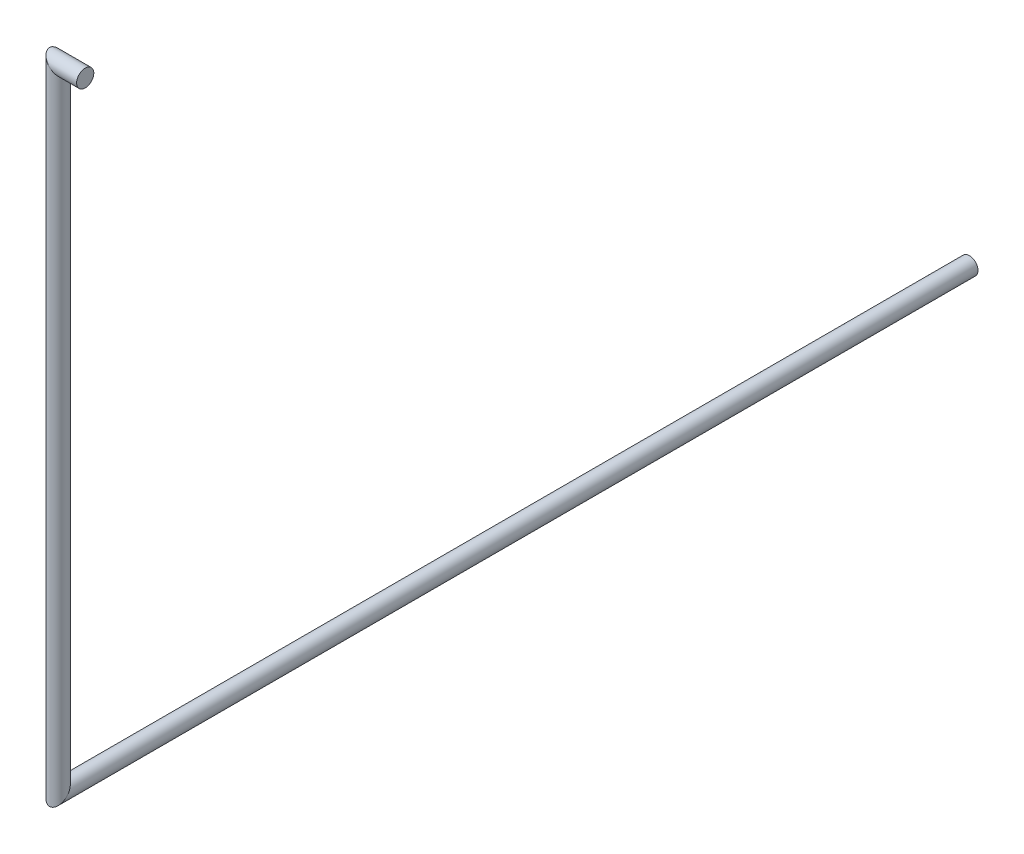
ISO-10303-21;
HEADER;
FILE_DESCRIPTION(('STEP AP214'),'2;1');
FILE_NAME('part.step','',(''),(''),'','','');
FILE_SCHEMA(('AUTOMOTIVE_DESIGN { 1 0 10303 214 1 1 1 1 }'));
ENDSEC;
DATA;
#1=APPLICATION_CONTEXT('core data for automotive mechanical design processes');
#2=APPLICATION_PROTOCOL_DEFINITION('international standard','automotive_design',2000,#1);
#3=PRODUCT_CONTEXT('',#1,'mechanical');
#4=PRODUCT('Part','Part','',(#3));
#5=PRODUCT_RELATED_PRODUCT_CATEGORY('part','',(#4));
#6=PRODUCT_DEFINITION_FORMATION('','',#4);
#7=PRODUCT_DEFINITION_CONTEXT('part definition',#1,'design');
#8=PRODUCT_DEFINITION('design','',#6,#7);
#9=PRODUCT_DEFINITION_SHAPE('','',#8);
#10=(LENGTH_UNIT() NAMED_UNIT(*) SI_UNIT(.MILLI.,.METRE.));
#11=(NAMED_UNIT(*) PLANE_ANGLE_UNIT() SI_UNIT($,.RADIAN.));
#12=(NAMED_UNIT(*) SI_UNIT($,.STERADIAN.) SOLID_ANGLE_UNIT());
#13=UNCERTAINTY_MEASURE_WITH_UNIT(LENGTH_MEASURE(1.E-05),#10,'distance_accuracy_value','');
#14=(GEOMETRIC_REPRESENTATION_CONTEXT(3) GLOBAL_UNCERTAINTY_ASSIGNED_CONTEXT((#13)) GLOBAL_UNIT_ASSIGNED_CONTEXT((#10,
#11,#12)) REPRESENTATION_CONTEXT('',''));
#15=CARTESIAN_POINT('',(0.,0.,0.));
#16=DIRECTION('',(0.,0.,1.));
#17=DIRECTION('',(1.,0.,0.));
#18=AXIS2_PLACEMENT_3D('',#15,#16,#17);
#19=CARTESIAN_POINT('',(0.,0.,10.));
#20=DIRECTION('',(0.,0.,-1.));
#21=DIRECTION('',(-1.,0.,0.));
#22=AXIS2_PLACEMENT_3D('',#19,#20,#21);
#23=CYLINDRICAL_SURFACE('',#22,9.525);
#24=CARTESIAN_POINT('',(0.,0.,0.));
#25=DIRECTION('',(0.,0.,1.));
#26=DIRECTION('',(1.,0.,0.));
#27=AXIS2_PLACEMENT_3D('',#24,#25,#26);
#28=CIRCLE('',#27,9.525);
#29=CARTESIAN_POINT('',(9.525,0.,0.));
#30=VERTEX_POINT('',#29);
#31=EDGE_CURVE('E11',#30,#30,#28,.T.);
#32=ORIENTED_EDGE('',*,*,#31,.T.);
#33=EDGE_LOOP('',(#32));
#34=FACE_BOUND('',#33,.T.);
#35=CARTESIAN_POINT('',(0.,0.,1010.));
#36=DIRECTION('',(0.,0.707106781186548,0.707106781186548));
#37=DIRECTION('',(0.,-0.707106781186548,0.707106781186548));
#38=AXIS2_PLACEMENT_3D('',#35,#36,#37);
#39=ELLIPSE('',#38,13.4703841816037,9.525);
#40=CARTESIAN_POINT('',(0.,-9.525,1019.525));
#41=VERTEX_POINT('',#40);
#42=EDGE_CURVE('E39',#41,#41,#39,.F.);
#43=ORIENTED_EDGE('',*,*,#42,.T.);
#44=EDGE_LOOP('',(#43));
#45=FACE_BOUND('',#44,.T.);
#46=ADVANCED_FACE('F32',(#34,#45),#23,.T.);
#47=CARTESIAN_POINT('',(0.,0.,0.));
#48=DIRECTION('',(0.,0.,1.));
#49=DIRECTION('',(1.,0.,0.));
#50=AXIS2_PLACEMENT_3D('',#47,#48,#49);
#51=PLANE('',#50);
#52=ORIENTED_EDGE('',*,*,#31,.F.);
#53=EDGE_LOOP('',(#52));
#54=FACE_BOUND('',#53,.T.);
#55=ADVANCED_FACE('F62',(#54),#51,.F.);
#56=CARTESIAN_POINT('',(30.,700.,1010.));
#57=DIRECTION('',(1.,0.,0.));
#58=DIRECTION('',(0.,-1.,0.));
#59=AXIS2_PLACEMENT_3D('',#56,#57,#58);
#60=PLANE('',#59);
#61=CARTESIAN_POINT('',(30.,700.,1010.));
#62=DIRECTION('',(1.,0.,0.));
#63=DIRECTION('',(0.,-1.,0.));
#64=AXIS2_PLACEMENT_3D('',#61,#62,#63);
#65=CIRCLE('',#64,9.525);
#66=CARTESIAN_POINT('',(30.,690.475,1010.));
#67=VERTEX_POINT('',#66);
#68=EDGE_CURVE('E44',#67,#67,#65,.T.);
#69=ORIENTED_EDGE('',*,*,#68,.T.);
#70=EDGE_LOOP('',(#69));
#71=FACE_BOUND('',#70,.T.);
#72=ADVANCED_FACE('F66',(#71),#60,.T.);
#73=CARTESIAN_POINT('',(-10.5774999999999,700.,1010.));
#74=DIRECTION('',(1.,0.,0.));
#75=DIRECTION('',(0.,0.,-1.));
#76=AXIS2_PLACEMENT_3D('',#73,#74,#75);
#77=CYLINDRICAL_SURFACE('',#76,9.525);
#78=CARTESIAN_POINT('',(0.,700.,1010.));
#79=DIRECTION('',(0.707106781186548,0.707106781186548,0.));
#80=DIRECTION('',(-0.707106781186548,0.707106781186548,0.));
#81=AXIS2_PLACEMENT_3D('',#78,#79,#80);
#82=ELLIPSE('',#81,13.4703841816037,9.525);
#83=CARTESIAN_POINT('',(-9.525,709.525,1010.));
#84=VERTEX_POINT('',#83);
#85=EDGE_CURVE('E49',#84,#84,#82,.F.);
#86=ORIENTED_EDGE('',*,*,#85,.F.);
#87=EDGE_LOOP('',(#86));
#88=FACE_BOUND('',#87,.T.);
#89=ORIENTED_EDGE('',*,*,#68,.F.);
#90=EDGE_LOOP('',(#89));
#91=FACE_BOUND('',#90,.T.);
#92=ADVANCED_FACE('F60',(#88,#91),#77,.T.);
#93=CARTESIAN_POINT('',(0.,-21.0549999999998,1010.));
#94=DIRECTION('',(0.,1.,0.));
#95=DIRECTION('',(0.,0.,1.));
#96=AXIS2_PLACEMENT_3D('',#93,#94,#95);
#97=CYLINDRICAL_SURFACE('',#96,9.525);
#98=ORIENTED_EDGE('',*,*,#42,.F.);
#99=EDGE_LOOP('',(#98));
#100=FACE_BOUND('',#99,.T.);
#101=ORIENTED_EDGE('',*,*,#85,.T.);
#102=EDGE_LOOP('',(#101));
#103=FACE_BOUND('',#102,.T.);
#104=ADVANCED_FACE('F54',(#100,#103),#97,.T.);
#105=CLOSED_SHELL('',(#46,#55,#72,#92,#104));
#106=MANIFOLD_SOLID_BREP('B2',#105);
#107=ADVANCED_BREP_SHAPE_REPRESENTATION('',(#18,#106),#14);
#108=SHAPE_DEFINITION_REPRESENTATION(#9,#107);
ENDSEC;
END-ISO-10303-21;
